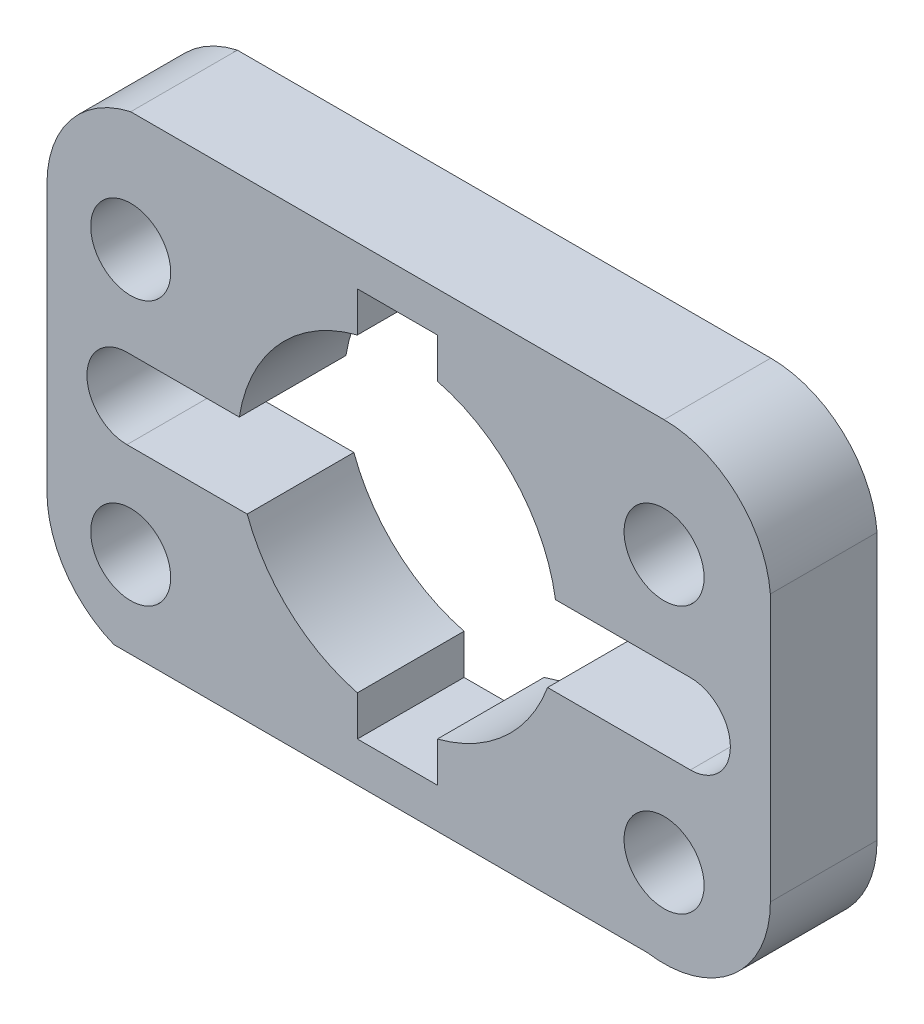
ISO-10303-21;
HEADER;
FILE_DESCRIPTION(('STEP AP214'),'2;1');
FILE_NAME('part.step','',(''),(''),'','','');
FILE_SCHEMA(('AUTOMOTIVE_DESIGN { 1 0 10303 214 1 1 1 1 }'));
ENDSEC;
DATA;
#1=APPLICATION_CONTEXT('core data for automotive mechanical design processes');
#2=APPLICATION_PROTOCOL_DEFINITION('international standard','automotive_design',2000,#1);
#3=PRODUCT_CONTEXT('',#1,'mechanical');
#4=PRODUCT('Part','Part','',(#3));
#5=PRODUCT_RELATED_PRODUCT_CATEGORY('part','',(#4));
#6=PRODUCT_DEFINITION_FORMATION('','',#4);
#7=PRODUCT_DEFINITION_CONTEXT('part definition',#1,'design');
#8=PRODUCT_DEFINITION('design','',#6,#7);
#9=PRODUCT_DEFINITION_SHAPE('','',#8);
#10=(LENGTH_UNIT() NAMED_UNIT(*) SI_UNIT(.MILLI.,.METRE.));
#11=(NAMED_UNIT(*) PLANE_ANGLE_UNIT() SI_UNIT($,.RADIAN.));
#12=(NAMED_UNIT(*) SI_UNIT($,.STERADIAN.) SOLID_ANGLE_UNIT());
#13=UNCERTAINTY_MEASURE_WITH_UNIT(LENGTH_MEASURE(1.E-05),#10,'distance_accuracy_value','');
#14=(GEOMETRIC_REPRESENTATION_CONTEXT(3) GLOBAL_UNCERTAINTY_ASSIGNED_CONTEXT((#13)) GLOBAL_UNIT_ASSIGNED_CONTEXT((#10,
#11,#12)) REPRESENTATION_CONTEXT('',''));
#15=CARTESIAN_POINT('',(0.,0.,0.));
#16=DIRECTION('',(0.,0.,1.));
#17=DIRECTION('',(1.,0.,0.));
#18=AXIS2_PLACEMENT_3D('',#15,#16,#17);
#19=CARTESIAN_POINT('',(5.46026095465038,2.99660257887407,25.4));
#20=DIRECTION('',(0.,0.,1.));
#21=DIRECTION('',(1.,0.,0.));
#22=AXIS2_PLACEMENT_3D('',#19,#20,#21);
#23=PLANE('',#22);
#24=CARTESIAN_POINT('',(127.000131196993,63.4875308494926,25.4));
#25=DIRECTION('',(0.,0.,1.));
#26=DIRECTION('',(1.,0.,0.));
#27=AXIS2_PLACEMENT_3D('',#24,#25,#26);
#28=CIRCLE('',#27,9.525);
#29=CARTESIAN_POINT('',(136.525131196993,63.4875308494926,25.4));
#30=VERTEX_POINT('',#29);
#31=EDGE_CURVE('E378',#30,#30,#28,.T.);
#32=ORIENTED_EDGE('',*,*,#31,.F.);
#33=EDGE_LOOP('',(#32));
#34=FACE_BOUND('',#33,.T.);
#35=CARTESIAN_POINT('',(0.,0.,25.4));
#36=DIRECTION('',(0.,0.,1.));
#37=DIRECTION('',(1.,0.,0.));
#38=AXIS2_PLACEMENT_3D('',#35,#36,#37);
#39=CIRCLE('',#38,9.525);
#40=CARTESIAN_POINT('',(9.525,0.,25.4));
#41=VERTEX_POINT('',#40);
#42=EDGE_CURVE('E394',#41,#41,#39,.T.);
#43=ORIENTED_EDGE('',*,*,#42,.F.);
#44=EDGE_LOOP('',(#43));
#45=FACE_BOUND('',#44,.T.);
#46=CARTESIAN_POINT('',(5.46026095465038,2.99660257887407,25.4));
#47=DIRECTION('',(0.,0.,1.));
#48=DIRECTION('',(1.,0.,0.));
#49=AXIS2_PLACEMENT_3D('',#46,#47,#48);
#50=CIRCLE('',#49,25.4);
#51=CARTESIAN_POINT('',(-19.9397390453496,2.99660257887407,25.4));
#52=VERTEX_POINT('',#51);
#53=CARTESIAN_POINT('',(-3.99585266549915,-20.577576414313,25.4));
#54=VERTEX_POINT('',#53);
#55=EDGE_CURVE('E402',#52,#54,#50,.T.);
#56=ORIENTED_EDGE('',*,*,#55,.T.);
#57=DIRECTION('',(1.,0.,0.));
#58=VECTOR('',#57,1.);
#59=CARTESIAN_POINT('',(-3.99585266549915,-20.577576414313,25.4));
#60=LINE('',#59,#58);
#61=CARTESIAN_POINT('',(123.004147334501,-20.577576414313,25.4));
#62=VERTEX_POINT('',#61);
#63=EDGE_CURVE('E406',#54,#62,#60,.T.);
#64=ORIENTED_EDGE('',*,*,#63,.T.);
#65=CARTESIAN_POINT('',(126.911571268505,4.52007363902799,25.4));
#66=DIRECTION('',(0.,0.,1.));
#67=DIRECTION('',(-1.,0.,0.));
#68=AXIS2_PLACEMENT_3D('',#65,#66,#67);
#69=CIRCLE('',#68,25.4);
#70=CARTESIAN_POINT('',(152.311571268505,4.52007363902799,25.4));
#71=VERTEX_POINT('',#70);
#72=EDGE_CURVE('E410',#62,#71,#69,.T.);
#73=ORIENTED_EDGE('',*,*,#72,.T.);
#74=DIRECTION('',(0.,1.,0.));
#75=VECTOR('',#74,1.);
#76=CARTESIAN_POINT('',(152.311571268505,4.52007363902799,25.4));
#77=LINE('',#76,#75);
#78=CARTESIAN_POINT('',(152.311571268506,68.020073639028,25.4));
#79=VERTEX_POINT('',#78);
#80=EDGE_CURVE('E413',#71,#79,#77,.T.);
#81=ORIENTED_EDGE('',*,*,#80,.T.);
#82=CARTESIAN_POINT('',(126.999973780064,65.9027563309383,25.4));
#83=DIRECTION('',(0.,0.,1.));
#84=DIRECTION('',(-1.,0.,0.));
#85=AXIS2_PLACEMENT_3D('',#82,#83,#84);
#86=CIRCLE('',#85,25.4);
#87=CARTESIAN_POINT('',(126.999973780064,91.3027563309383,25.4));
#88=VERTEX_POINT('',#87);
#89=EDGE_CURVE('E416',#79,#88,#86,.T.);
#90=ORIENTED_EDGE('',*,*,#89,.T.);
#91=DIRECTION('',(-1.,0.,0.));
#92=VECTOR('',#91,1.);
#93=CARTESIAN_POINT('',(-2.62199357100278E-05,91.3027563309383,25.4));
#94=LINE('',#93,#92);
#95=CARTESIAN_POINT('',(-2.62199357100278E-05,91.3027563309383,25.4));
#96=VERTEX_POINT('',#95);
#97=EDGE_CURVE('E419',#88,#96,#94,.T.);
#98=ORIENTED_EDGE('',*,*,#97,.T.);
#99=CARTESIAN_POINT('',(5.46026095465038,66.4966025788741,25.4));
#100=DIRECTION('',(0.,0.,1.));
#101=DIRECTION('',(-1.,0.,0.));
#102=AXIS2_PLACEMENT_3D('',#99,#100,#101);
#103=CIRCLE('',#102,25.4);
#104=CARTESIAN_POINT('',(-19.9397390453496,66.4966025788741,25.4));
#105=VERTEX_POINT('',#104);
#106=EDGE_CURVE('E422',#96,#105,#103,.T.);
#107=ORIENTED_EDGE('',*,*,#106,.T.);
#108=DIRECTION('',(0.,-1.,0.));
#109=VECTOR('',#108,1.);
#110=CARTESIAN_POINT('',(-19.9397390453496,2.99660257887407,25.4));
#111=LINE('',#110,#109);
#112=EDGE_CURVE('E425',#105,#52,#111,.T.);
#113=ORIENTED_EDGE('',*,*,#112,.T.);
#114=EDGE_LOOP('',(#56,#64,#73,#81,#90,#98,#107,#113));
#115=FACE_BOUND('',#114,.T.);
#116=CARTESIAN_POINT('',(0.00144480953424519,62.9099013316316,25.4));
#117=DIRECTION('',(0.,0.,1.));
#118=DIRECTION('',(1.,0.,0.));
#119=AXIS2_PLACEMENT_3D('',#116,#117,#118);
#120=CIRCLE('',#119,9.525);
#121=CARTESIAN_POINT('',(9.52644480953425,62.9099013316316,25.4));
#122=VERTEX_POINT('',#121);
#123=EDGE_CURVE('E386',#122,#122,#120,.T.);
#124=ORIENTED_EDGE('',*,*,#123,.F.);
#125=EDGE_LOOP('',(#124));
#126=FACE_BOUND('',#125,.T.);
#127=CARTESIAN_POINT('',(126.999999387875,-0.0124691503705643,25.4));
#128=DIRECTION('',(0.,0.,1.));
#129=DIRECTION('',(1.,0.,0.));
#130=AXIS2_PLACEMENT_3D('',#127,#128,#129);
#131=CIRCLE('',#130,9.525);
#132=CARTESIAN_POINT('',(136.524999387875,-0.0124691503705643,25.4));
#133=VERTEX_POINT('',#132);
#134=EDGE_CURVE('E370',#133,#133,#131,.T.);
#135=ORIENTED_EDGE('',*,*,#134,.F.);
#136=EDGE_LOOP('',(#135));
#137=FACE_BOUND('',#136,.T.);
#138=DIRECTION('',(1.,0.,0.));
#139=VECTOR('',#138,1.);
#140=CARTESIAN_POINT('',(99.2587184535204,22.2125308496294,25.4));
#141=LINE('',#140,#139);
#142=CARTESIAN_POINT('',(99.2587184535204,22.2125308496294,25.4));
#143=VERTEX_POINT('',#142);
#144=CARTESIAN_POINT('',(133.261571268505,22.2125308496295,25.4));
#145=VERTEX_POINT('',#144);
#146=EDGE_CURVE('E208',#143,#145,#141,.T.);
#147=ORIENTED_EDGE('',*,*,#146,.F.);
#148=CARTESIAN_POINT('',(63.5,35.3625899583126,25.4));
#149=DIRECTION('',(0.,0.,1.));
#150=DIRECTION('',(1.,0.,0.));
#151=AXIS2_PLACEMENT_3D('',#148,#149,#150);
#152=CIRCLE('',#151,38.1);
#153=CARTESIAN_POINT('',(73.025,-1.527576414313,25.4));
#154=VERTEX_POINT('',#153);
#155=EDGE_CURVE('E199',#154,#143,#152,.T.);
#156=ORIENTED_EDGE('',*,*,#155,.F.);
#157=DIRECTION('',(0.,1.,0.));
#158=VECTOR('',#157,1.);
#159=CARTESIAN_POINT('',(73.025,-1.527576414313,25.4));
#160=LINE('',#159,#158);
#161=CARTESIAN_POINT('',(73.025,-11.052576414313,25.4));
#162=VERTEX_POINT('',#161);
#163=EDGE_CURVE('E264',#162,#154,#160,.T.);
#164=ORIENTED_EDGE('',*,*,#163,.F.);
#165=DIRECTION('',(1.,0.,0.));
#166=VECTOR('',#165,1.);
#167=CARTESIAN_POINT('',(62.799638263455,-11.052576414313,25.4));
#168=LINE('',#167,#166);
#169=CARTESIAN_POINT('',(53.975,-11.052576414313,25.4));
#170=VERTEX_POINT('',#169);
#171=EDGE_CURVE('E261',#170,#162,#168,.T.);
#172=ORIENTED_EDGE('',*,*,#171,.F.);
#173=DIRECTION('',(0.,-1.,0.));
#174=VECTOR('',#173,1.);
#175=CARTESIAN_POINT('',(53.975,-1.527576414313,25.4));
#176=LINE('',#175,#174);
#177=CARTESIAN_POINT('',(53.975,-1.527576414313,25.4));
#178=VERTEX_POINT('',#177);
#179=EDGE_CURVE('E258',#178,#170,#176,.T.);
#180=ORIENTED_EDGE('',*,*,#179,.F.);
#181=CARTESIAN_POINT('',(63.5,35.3625899583126,25.4));
#182=DIRECTION('',(0.,0.,1.));
#183=DIRECTION('',(1.,0.,0.));
#184=AXIS2_PLACEMENT_3D('',#181,#182,#183);
#185=CIRCLE('',#184,38.1);
#186=CARTESIAN_POINT('',(27.7412815464796,22.2125308496294,25.4));
#187=VERTEX_POINT('',#186);
#188=EDGE_CURVE('E255',#187,#178,#185,.T.);
#189=ORIENTED_EDGE('',*,*,#188,.F.);
#190=DIRECTION('',(1.,0.,0.));
#191=VECTOR('',#190,1.);
#192=CARTESIAN_POINT('',(-0.889739045349613,22.2125308496294,25.4));
#193=LINE('',#192,#191);
#194=CARTESIAN_POINT('',(-0.889739045349615,22.2125308496294,25.4));
#195=VERTEX_POINT('',#194);
#196=EDGE_CURVE('E252',#195,#187,#193,.T.);
#197=ORIENTED_EDGE('',*,*,#196,.F.);
#198=CARTESIAN_POINT('',(-0.889739045349613,31.7375308496294,25.4));
#199=DIRECTION('',(0.,0.,1.));
#200=DIRECTION('',(1.,0.,0.));
#201=AXIS2_PLACEMENT_3D('',#198,#199,#200);
#202=CIRCLE('',#201,9.525);
#203=CARTESIAN_POINT('',(-0.889739045349613,41.2625308496294,25.4));
#204=VERTEX_POINT('',#203);
#205=EDGE_CURVE('E249',#204,#195,#202,.T.);
#206=ORIENTED_EDGE('',*,*,#205,.F.);
#207=DIRECTION('',(-1.,0.,0.));
#208=VECTOR('',#207,1.);
#209=CARTESIAN_POINT('',(-0.889739045349613,41.2625308496294,25.4));
#210=LINE('',#209,#208);
#211=CARTESIAN_POINT('',(25.8595869114197,41.2625308496294,25.4));
#212=VERTEX_POINT('',#211);
#213=EDGE_CURVE('E246',#212,#204,#210,.T.);
#214=ORIENTED_EDGE('',*,*,#213,.F.);
#215=CARTESIAN_POINT('',(63.5,35.3625899583126,25.4));
#216=DIRECTION('',(0.,0.,1.));
#217=DIRECTION('',(1.,0.,0.));
#218=AXIS2_PLACEMENT_3D('',#215,#216,#217);
#219=CIRCLE('',#218,38.1);
#220=CARTESIAN_POINT('',(53.975,72.2527563309383,25.4));
#221=VERTEX_POINT('',#220);
#222=EDGE_CURVE('E243',#221,#212,#219,.T.);
#223=ORIENTED_EDGE('',*,*,#222,.F.);
#224=DIRECTION('',(0.,-1.,0.));
#225=VECTOR('',#224,1.);
#226=CARTESIAN_POINT('',(53.975,72.2527563309383,25.4));
#227=LINE('',#226,#225);
#228=CARTESIAN_POINT('',(53.975,81.7777563309383,25.4));
#229=VERTEX_POINT('',#228);
#230=EDGE_CURVE('E240',#229,#221,#227,.T.);
#231=ORIENTED_EDGE('',*,*,#230,.F.);
#232=DIRECTION('',(-1.,0.,0.));
#233=VECTOR('',#232,1.);
#234=CARTESIAN_POINT('',(62.3561666756041,81.7777563309383,25.4));
#235=LINE('',#234,#233);
#236=CARTESIAN_POINT('',(73.025,81.7777563309383,25.4));
#237=VERTEX_POINT('',#236);
#238=EDGE_CURVE('E237',#237,#229,#235,.T.);
#239=ORIENTED_EDGE('',*,*,#238,.F.);
#240=DIRECTION('',(0.,1.,0.));
#241=VECTOR('',#240,1.);
#242=CARTESIAN_POINT('',(73.025,72.2527563309383,25.4));
#243=LINE('',#242,#241);
#244=CARTESIAN_POINT('',(73.025,72.2527563309383,25.4));
#245=VERTEX_POINT('',#244);
#246=EDGE_CURVE('E234',#245,#237,#243,.T.);
#247=ORIENTED_EDGE('',*,*,#246,.F.);
#248=CARTESIAN_POINT('',(63.5,35.3625899583126,25.4));
#249=DIRECTION('',(0.,0.,1.));
#250=DIRECTION('',(1.,0.,0.));
#251=AXIS2_PLACEMENT_3D('',#248,#249,#250);
#252=CIRCLE('',#251,38.1);
#253=CARTESIAN_POINT('',(101.14041308858,41.2625308496294,25.4));
#254=VERTEX_POINT('',#253);
#255=EDGE_CURVE('E231',#254,#245,#252,.T.);
#256=ORIENTED_EDGE('',*,*,#255,.F.);
#257=DIRECTION('',(-1.,0.,0.));
#258=VECTOR('',#257,1.);
#259=CARTESIAN_POINT('',(101.14041308858,41.2625308496294,25.4));
#260=LINE('',#259,#258);
#261=CARTESIAN_POINT('',(133.261571268505,41.2625308496294,25.4));
#262=VERTEX_POINT('',#261);
#263=EDGE_CURVE('E226',#262,#254,#260,.T.);
#264=ORIENTED_EDGE('',*,*,#263,.F.);
#265=CARTESIAN_POINT('',(133.261571268505,31.7375308496294,25.4));
#266=DIRECTION('',(0.,0.,1.));
#267=DIRECTION('',(1.,0.,0.));
#268=AXIS2_PLACEMENT_3D('',#265,#266,#267);
#269=CIRCLE('',#268,9.52499999999998);
#270=EDGE_CURVE('E222',#145,#262,#269,.T.);
#271=ORIENTED_EDGE('',*,*,#270,.F.);
#272=EDGE_LOOP('',(#147,#156,#164,#172,#180,#189,#197,#206,#214,#223,#231,#239,#247,#256,#264,#271));
#273=FACE_BOUND('',#272,.T.);
#274=ADVANCED_FACE('F37',(#34,#45,#115,#126,#137,#273),#23,.T.);
#275=CARTESIAN_POINT('',(5.46026095465038,2.99660257887407,0.));
#276=DIRECTION('',(0.,0.,1.));
#277=DIRECTION('',(1.,0.,0.));
#278=AXIS2_PLACEMENT_3D('',#275,#276,#277);
#279=PLANE('',#278);
#280=CARTESIAN_POINT('',(126.999999387875,-0.0124691503705643,0.));
#281=DIRECTION('',(0.,0.,1.));
#282=DIRECTION('',(1.,0.,0.));
#283=AXIS2_PLACEMENT_3D('',#280,#281,#282);
#284=CIRCLE('',#283,9.525);
#285=CARTESIAN_POINT('',(136.524999387875,-0.0124691503705643,0.));
#286=VERTEX_POINT('',#285);
#287=EDGE_CURVE('E217',#286,#286,#284,.T.);
#288=ORIENTED_EDGE('',*,*,#287,.T.);
#289=EDGE_LOOP('',(#288));
#290=FACE_BOUND('',#289,.T.);
#291=CARTESIAN_POINT('',(127.000131196993,63.4875308494926,0.));
#292=DIRECTION('',(0.,0.,1.));
#293=DIRECTION('',(1.,0.,0.));
#294=AXIS2_PLACEMENT_3D('',#291,#292,#293);
#295=CIRCLE('',#294,9.525);
#296=CARTESIAN_POINT('',(136.525131196993,63.4875308494926,0.));
#297=VERTEX_POINT('',#296);
#298=EDGE_CURVE('E374',#297,#297,#295,.T.);
#299=ORIENTED_EDGE('',*,*,#298,.T.);
#300=EDGE_LOOP('',(#299));
#301=FACE_BOUND('',#300,.T.);
#302=CARTESIAN_POINT('',(0.00144480953424519,62.9099013316316,0.));
#303=DIRECTION('',(0.,0.,1.));
#304=DIRECTION('',(1.,0.,0.));
#305=AXIS2_PLACEMENT_3D('',#302,#303,#304);
#306=CIRCLE('',#305,9.525);
#307=CARTESIAN_POINT('',(9.52644480953425,62.9099013316316,0.));
#308=VERTEX_POINT('',#307);
#309=EDGE_CURVE('E382',#308,#308,#306,.T.);
#310=ORIENTED_EDGE('',*,*,#309,.T.);
#311=EDGE_LOOP('',(#310));
#312=FACE_BOUND('',#311,.T.);
#313=CARTESIAN_POINT('',(0.,0.,0.));
#314=DIRECTION('',(0.,0.,1.));
#315=DIRECTION('',(1.,0.,0.));
#316=AXIS2_PLACEMENT_3D('',#313,#314,#315);
#317=CIRCLE('',#316,9.525);
#318=CARTESIAN_POINT('',(9.525,0.,0.));
#319=VERTEX_POINT('',#318);
#320=EDGE_CURVE('E390',#319,#319,#317,.T.);
#321=ORIENTED_EDGE('',*,*,#320,.T.);
#322=EDGE_LOOP('',(#321));
#323=FACE_BOUND('',#322,.T.);
#324=CARTESIAN_POINT('',(5.46026095465038,2.99660257887407,0.));
#325=DIRECTION('',(0.,0.,1.));
#326=DIRECTION('',(1.,0.,0.));
#327=AXIS2_PLACEMENT_3D('',#324,#325,#326);
#328=CIRCLE('',#327,25.4);
#329=CARTESIAN_POINT('',(-19.9397390453496,2.99660257887407,0.));
#330=VERTEX_POINT('',#329);
#331=CARTESIAN_POINT('',(-3.99585266549915,-20.577576414313,0.));
#332=VERTEX_POINT('',#331);
#333=EDGE_CURVE('E398',#330,#332,#328,.T.);
#334=ORIENTED_EDGE('',*,*,#333,.F.);
#335=DIRECTION('',(0.,-1.,0.));
#336=VECTOR('',#335,1.);
#337=CARTESIAN_POINT('',(-19.9397390453496,2.99660257887407,0.));
#338=LINE('',#337,#336);
#339=CARTESIAN_POINT('',(-19.9397390453496,66.4966025788741,0.));
#340=VERTEX_POINT('',#339);
#341=EDGE_CURVE('E407',#340,#330,#338,.T.);
#342=ORIENTED_EDGE('',*,*,#341,.F.);
#343=CARTESIAN_POINT('',(5.46026095465038,66.4966025788741,0.));
#344=DIRECTION('',(0.,0.,1.));
#345=DIRECTION('',(-1.,0.,0.));
#346=AXIS2_PLACEMENT_3D('',#343,#344,#345);
#347=CIRCLE('',#346,25.4);
#348=CARTESIAN_POINT('',(-2.62199357100278E-05,91.3027563309383,0.));
#349=VERTEX_POINT('',#348);
#350=EDGE_CURVE('E447',#349,#340,#347,.T.);
#351=ORIENTED_EDGE('',*,*,#350,.F.);
#352=DIRECTION('',(-1.,0.,0.));
#353=VECTOR('',#352,1.);
#354=CARTESIAN_POINT('',(-2.62199357100278E-05,91.3027563309383,0.));
#355=LINE('',#354,#353);
#356=CARTESIAN_POINT('',(126.999973780064,91.3027563309383,0.));
#357=VERTEX_POINT('',#356);
#358=EDGE_CURVE('E444',#357,#349,#355,.T.);
#359=ORIENTED_EDGE('',*,*,#358,.F.);
#360=CARTESIAN_POINT('',(126.999973780064,65.9027563309383,0.));
#361=DIRECTION('',(0.,0.,1.));
#362=DIRECTION('',(-1.,0.,0.));
#363=AXIS2_PLACEMENT_3D('',#360,#361,#362);
#364=CIRCLE('',#363,25.4);
#365=CARTESIAN_POINT('',(152.311571268506,68.020073639028,0.));
#366=VERTEX_POINT('',#365);
#367=EDGE_CURVE('E441',#366,#357,#364,.T.);
#368=ORIENTED_EDGE('',*,*,#367,.F.);
#369=DIRECTION('',(0.,1.,0.));
#370=VECTOR('',#369,1.);
#371=CARTESIAN_POINT('',(152.311571268505,4.52007363902799,0.));
#372=LINE('',#371,#370);
#373=CARTESIAN_POINT('',(152.311571268505,4.52007363902799,0.));
#374=VERTEX_POINT('',#373);
#375=EDGE_CURVE('E438',#374,#366,#372,.T.);
#376=ORIENTED_EDGE('',*,*,#375,.F.);
#377=CARTESIAN_POINT('',(126.911571268505,4.52007363902799,0.));
#378=DIRECTION('',(0.,0.,1.));
#379=DIRECTION('',(-1.,0.,0.));
#380=AXIS2_PLACEMENT_3D('',#377,#378,#379);
#381=CIRCLE('',#380,25.4);
#382=CARTESIAN_POINT('',(123.004147334501,-20.577576414313,0.));
#383=VERTEX_POINT('',#382);
#384=EDGE_CURVE('E435',#383,#374,#381,.T.);
#385=ORIENTED_EDGE('',*,*,#384,.F.);
#386=DIRECTION('',(1.,0.,0.));
#387=VECTOR('',#386,1.);
#388=CARTESIAN_POINT('',(-3.99585266549915,-20.577576414313,0.));
#389=LINE('',#388,#387);
#390=EDGE_CURVE('E432',#332,#383,#389,.T.);
#391=ORIENTED_EDGE('',*,*,#390,.F.);
#392=EDGE_LOOP('',(#334,#342,#351,#359,#368,#376,#385,#391));
#393=FACE_BOUND('',#392,.T.);
#394=CARTESIAN_POINT('',(63.5,35.3625899583126,0.));
#395=DIRECTION('',(0.,0.,1.));
#396=DIRECTION('',(1.,0.,0.));
#397=AXIS2_PLACEMENT_3D('',#394,#395,#396);
#398=CIRCLE('',#397,38.1);
#399=CARTESIAN_POINT('',(73.025,-1.527576414313,0.));
#400=VERTEX_POINT('',#399);
#401=CARTESIAN_POINT('',(99.2587184535204,22.2125308496294,0.));
#402=VERTEX_POINT('',#401);
#403=EDGE_CURVE('E61',#400,#402,#398,.T.);
#404=ORIENTED_EDGE('',*,*,#403,.T.);
#405=DIRECTION('',(1.,0.,0.));
#406=VECTOR('',#405,1.);
#407=CARTESIAN_POINT('',(99.2587184535204,22.2125308496294,0.));
#408=LINE('',#407,#406);
#409=CARTESIAN_POINT('',(133.261571268505,22.2125308496295,0.));
#410=VERTEX_POINT('',#409);
#411=EDGE_CURVE('E215',#402,#410,#408,.T.);
#412=ORIENTED_EDGE('',*,*,#411,.T.);
#413=CARTESIAN_POINT('',(133.261571268505,31.7375308496294,0.));
#414=DIRECTION('',(0.,0.,1.));
#415=DIRECTION('',(1.,0.,0.));
#416=AXIS2_PLACEMENT_3D('',#413,#414,#415);
#417=CIRCLE('',#416,9.52499999999998);
#418=CARTESIAN_POINT('',(133.261571268505,41.2625308496294,0.));
#419=VERTEX_POINT('',#418);
#420=EDGE_CURVE('E271',#410,#419,#417,.T.);
#421=ORIENTED_EDGE('',*,*,#420,.T.);
#422=DIRECTION('',(-1.,0.,0.));
#423=VECTOR('',#422,1.);
#424=CARTESIAN_POINT('',(101.14041308858,41.2625308496294,0.));
#425=LINE('',#424,#423);
#426=CARTESIAN_POINT('',(101.14041308858,41.2625308496294,0.));
#427=VERTEX_POINT('',#426);
#428=EDGE_CURVE('E275',#419,#427,#425,.T.);
#429=ORIENTED_EDGE('',*,*,#428,.T.);
#430=CARTESIAN_POINT('',(63.5,35.3625899583126,0.));
#431=DIRECTION('',(0.,0.,1.));
#432=DIRECTION('',(1.,0.,0.));
#433=AXIS2_PLACEMENT_3D('',#430,#431,#432);
#434=CIRCLE('',#433,38.1);
#435=CARTESIAN_POINT('',(73.025,72.2527563309383,0.));
#436=VERTEX_POINT('',#435);
#437=EDGE_CURVE('E279',#427,#436,#434,.T.);
#438=ORIENTED_EDGE('',*,*,#437,.T.);
#439=DIRECTION('',(0.,1.,0.));
#440=VECTOR('',#439,1.);
#441=CARTESIAN_POINT('',(73.025,72.2527563309383,0.));
#442=LINE('',#441,#440);
#443=CARTESIAN_POINT('',(73.025,81.7777563309383,0.));
#444=VERTEX_POINT('',#443);
#445=EDGE_CURVE('E283',#436,#444,#442,.T.);
#446=ORIENTED_EDGE('',*,*,#445,.T.);
#447=DIRECTION('',(-1.,0.,0.));
#448=VECTOR('',#447,1.);
#449=CARTESIAN_POINT('',(62.3561666756041,81.7777563309383,0.));
#450=LINE('',#449,#448);
#451=CARTESIAN_POINT('',(53.975,81.7777563309383,0.));
#452=VERTEX_POINT('',#451);
#453=EDGE_CURVE('E287',#444,#452,#450,.T.);
#454=ORIENTED_EDGE('',*,*,#453,.T.);
#455=DIRECTION('',(0.,-1.,0.));
#456=VECTOR('',#455,1.);
#457=CARTESIAN_POINT('',(53.975,72.2527563309383,0.));
#458=LINE('',#457,#456);
#459=CARTESIAN_POINT('',(53.975,72.2527563309383,0.));
#460=VERTEX_POINT('',#459);
#461=EDGE_CURVE('E291',#452,#460,#458,.T.);
#462=ORIENTED_EDGE('',*,*,#461,.T.);
#463=CARTESIAN_POINT('',(63.5,35.3625899583126,0.));
#464=DIRECTION('',(0.,0.,1.));
#465=DIRECTION('',(1.,0.,0.));
#466=AXIS2_PLACEMENT_3D('',#463,#464,#465);
#467=CIRCLE('',#466,38.1);
#468=CARTESIAN_POINT('',(25.8595869114197,41.2625308496294,0.));
#469=VERTEX_POINT('',#468);
#470=EDGE_CURVE('E295',#460,#469,#467,.T.);
#471=ORIENTED_EDGE('',*,*,#470,.T.);
#472=DIRECTION('',(-1.,0.,0.));
#473=VECTOR('',#472,1.);
#474=CARTESIAN_POINT('',(-0.889739045349613,41.2625308496294,0.));
#475=LINE('',#474,#473);
#476=CARTESIAN_POINT('',(-0.889739045349613,41.2625308496294,0.));
#477=VERTEX_POINT('',#476);
#478=EDGE_CURVE('E299',#469,#477,#475,.T.);
#479=ORIENTED_EDGE('',*,*,#478,.T.);
#480=CARTESIAN_POINT('',(-0.889739045349613,31.7375308496294,0.));
#481=DIRECTION('',(0.,0.,1.));
#482=DIRECTION('',(1.,0.,0.));
#483=AXIS2_PLACEMENT_3D('',#480,#481,#482);
#484=CIRCLE('',#483,9.525);
#485=CARTESIAN_POINT('',(-0.889739045349615,22.2125308496294,0.));
#486=VERTEX_POINT('',#485);
#487=EDGE_CURVE('E303',#477,#486,#484,.T.);
#488=ORIENTED_EDGE('',*,*,#487,.T.);
#489=DIRECTION('',(1.,0.,0.));
#490=VECTOR('',#489,1.);
#491=CARTESIAN_POINT('',(-0.889739045349613,22.2125308496294,0.));
#492=LINE('',#491,#490);
#493=CARTESIAN_POINT('',(27.7412815464796,22.2125308496294,0.));
#494=VERTEX_POINT('',#493);
#495=EDGE_CURVE('E307',#486,#494,#492,.T.);
#496=ORIENTED_EDGE('',*,*,#495,.T.);
#497=CARTESIAN_POINT('',(63.5,35.3625899583126,0.));
#498=DIRECTION('',(0.,0.,1.));
#499=DIRECTION('',(1.,0.,0.));
#500=AXIS2_PLACEMENT_3D('',#497,#498,#499);
#501=CIRCLE('',#500,38.1);
#502=CARTESIAN_POINT('',(53.975,-1.527576414313,0.));
#503=VERTEX_POINT('',#502);
#504=EDGE_CURVE('E311',#494,#503,#501,.T.);
#505=ORIENTED_EDGE('',*,*,#504,.T.);
#506=DIRECTION('',(0.,-1.,0.));
#507=VECTOR('',#506,1.);
#508=CARTESIAN_POINT('',(53.975,-1.527576414313,0.));
#509=LINE('',#508,#507);
#510=CARTESIAN_POINT('',(53.975,-11.052576414313,0.));
#511=VERTEX_POINT('',#510);
#512=EDGE_CURVE('E315',#503,#511,#509,.T.);
#513=ORIENTED_EDGE('',*,*,#512,.T.);
#514=DIRECTION('',(1.,0.,0.));
#515=VECTOR('',#514,1.);
#516=CARTESIAN_POINT('',(62.799638263455,-11.052576414313,0.));
#517=LINE('',#516,#515);
#518=CARTESIAN_POINT('',(73.025,-11.052576414313,0.));
#519=VERTEX_POINT('',#518);
#520=EDGE_CURVE('E319',#511,#519,#517,.T.);
#521=ORIENTED_EDGE('',*,*,#520,.T.);
#522=DIRECTION('',(0.,1.,0.));
#523=VECTOR('',#522,1.);
#524=CARTESIAN_POINT('',(73.025,-1.527576414313,0.));
#525=LINE('',#524,#523);
#526=EDGE_CURVE('E209',#519,#400,#525,.T.);
#527=ORIENTED_EDGE('',*,*,#526,.T.);
#528=EDGE_LOOP('',(#404,#412,#421,#429,#438,#446,#454,#462,#471,#479,#488,#496,#505,#513,#521,#527));
#529=FACE_BOUND('',#528,.T.);
#530=ADVANCED_FACE('F486',(#290,#301,#312,#323,#393,#529),#279,.F.);
#531=CARTESIAN_POINT('',(5.46026095465038,2.99660257887407,25.4));
#532=DIRECTION('',(0.,0.,-1.));
#533=DIRECTION('',(-1.,0.,0.));
#534=AXIS2_PLACEMENT_3D('',#531,#532,#533);
#535=CYLINDRICAL_SURFACE('',#534,25.4);
#536=ORIENTED_EDGE('',*,*,#333,.T.);
#537=DIRECTION('',(0.,0.,-1.));
#538=VECTOR('',#537,1.);
#539=CARTESIAN_POINT('',(-3.99585266549915,-20.577576414313,25.4));
#540=LINE('',#539,#538);
#541=EDGE_CURVE('E11',#54,#332,#540,.T.);
#542=ORIENTED_EDGE('',*,*,#541,.F.);
#543=ORIENTED_EDGE('',*,*,#55,.F.);
#544=DIRECTION('',(0.,0.,-1.));
#545=VECTOR('',#544,1.);
#546=CARTESIAN_POINT('',(-19.9397390453496,2.99660257887407,25.4));
#547=LINE('',#546,#545);
#548=EDGE_CURVE('E428',#52,#330,#547,.T.);
#549=ORIENTED_EDGE('',*,*,#548,.T.);
#550=EDGE_LOOP('',(#536,#542,#543,#549));
#551=FACE_BOUND('',#550,.T.);
#552=ADVANCED_FACE('F39',(#551),#535,.T.);
#553=CARTESIAN_POINT('',(-3.99585266549915,-20.577576414313,25.4));
#554=DIRECTION('',(0.,1.,0.));
#555=DIRECTION('',(0.,0.,1.));
#556=AXIS2_PLACEMENT_3D('',#553,#554,#555);
#557=PLANE('',#556);
#558=ORIENTED_EDGE('',*,*,#390,.T.);
#559=DIRECTION('',(0.,0.,-1.));
#560=VECTOR('',#559,1.);
#561=CARTESIAN_POINT('',(123.004147334501,-20.577576414313,25.4));
#562=LINE('',#561,#560);
#563=EDGE_CURVE('E46',#62,#383,#562,.T.);
#564=ORIENTED_EDGE('',*,*,#563,.F.);
#565=ORIENTED_EDGE('',*,*,#63,.F.);
#566=ORIENTED_EDGE('',*,*,#541,.T.);
#567=EDGE_LOOP('',(#558,#564,#565,#566));
#568=FACE_BOUND('',#567,.T.);
#569=ADVANCED_FACE('F504',(#568),#557,.F.);
#570=CARTESIAN_POINT('',(126.911571268505,4.52007363902799,25.4));
#571=DIRECTION('',(0.,0.,-1.));
#572=DIRECTION('',(-1.,0.,0.));
#573=AXIS2_PLACEMENT_3D('',#570,#571,#572);
#574=CYLINDRICAL_SURFACE('',#573,25.4);
#575=ORIENTED_EDGE('',*,*,#384,.T.);
#576=DIRECTION('',(0.,0.,-1.));
#577=VECTOR('',#576,1.);
#578=CARTESIAN_POINT('',(152.311571268505,4.52007363902799,25.4));
#579=LINE('',#578,#577);
#580=EDGE_CURVE('E471',#71,#374,#579,.T.);
#581=ORIENTED_EDGE('',*,*,#580,.F.);
#582=ORIENTED_EDGE('',*,*,#72,.F.);
#583=ORIENTED_EDGE('',*,*,#563,.T.);
#584=EDGE_LOOP('',(#575,#581,#582,#583));
#585=FACE_BOUND('',#584,.T.);
#586=ADVANCED_FACE('F480',(#585),#574,.T.);
#587=CARTESIAN_POINT('',(152.311571268505,4.52007363902799,25.4));
#588=DIRECTION('',(-1.,0.,0.));
#589=DIRECTION('',(0.,-1.,0.));
#590=AXIS2_PLACEMENT_3D('',#587,#588,#589);
#591=PLANE('',#590);
#592=ORIENTED_EDGE('',*,*,#375,.T.);
#593=DIRECTION('',(0.,0.,-1.));
#594=VECTOR('',#593,1.);
#595=CARTESIAN_POINT('',(152.311571268506,68.020073639028,25.4));
#596=LINE('',#595,#594);
#597=EDGE_CURVE('E467',#79,#366,#596,.T.);
#598=ORIENTED_EDGE('',*,*,#597,.F.);
#599=ORIENTED_EDGE('',*,*,#80,.F.);
#600=ORIENTED_EDGE('',*,*,#580,.T.);
#601=EDGE_LOOP('',(#592,#598,#599,#600));
#602=FACE_BOUND('',#601,.T.);
#603=ADVANCED_FACE('F492',(#602),#591,.F.);
#604=CARTESIAN_POINT('',(126.999973780064,65.9027563309383,25.4));
#605=DIRECTION('',(0.,0.,-1.));
#606=DIRECTION('',(-1.,0.,0.));
#607=AXIS2_PLACEMENT_3D('',#604,#605,#606);
#608=CYLINDRICAL_SURFACE('',#607,25.4);
#609=ORIENTED_EDGE('',*,*,#367,.T.);
#610=DIRECTION('',(0.,0.,-1.));
#611=VECTOR('',#610,1.);
#612=CARTESIAN_POINT('',(126.999973780064,91.3027563309383,25.4));
#613=LINE('',#612,#611);
#614=EDGE_CURVE('E463',#88,#357,#613,.T.);
#615=ORIENTED_EDGE('',*,*,#614,.F.);
#616=ORIENTED_EDGE('',*,*,#89,.F.);
#617=ORIENTED_EDGE('',*,*,#597,.T.);
#618=EDGE_LOOP('',(#609,#615,#616,#617));
#619=FACE_BOUND('',#618,.T.);
#620=ADVANCED_FACE('F496',(#619),#608,.T.);
#621=CARTESIAN_POINT('',(-2.62199357100278E-05,91.3027563309383,25.4));
#622=DIRECTION('',(0.,-1.,0.));
#623=DIRECTION('',(1.,0.,0.));
#624=AXIS2_PLACEMENT_3D('',#621,#622,#623);
#625=PLANE('',#624);
#626=ORIENTED_EDGE('',*,*,#358,.T.);
#627=DIRECTION('',(0.,0.,-1.));
#628=VECTOR('',#627,1.);
#629=CARTESIAN_POINT('',(-2.62199357100278E-05,91.3027563309383,25.4));
#630=LINE('',#629,#628);
#631=EDGE_CURVE('E459',#96,#349,#630,.T.);
#632=ORIENTED_EDGE('',*,*,#631,.F.);
#633=ORIENTED_EDGE('',*,*,#97,.F.);
#634=ORIENTED_EDGE('',*,*,#614,.T.);
#635=EDGE_LOOP('',(#626,#632,#633,#634));
#636=FACE_BOUND('',#635,.T.);
#637=ADVANCED_FACE('F517',(#636),#625,.F.);
#638=CARTESIAN_POINT('',(5.46026095465038,66.4966025788741,25.4));
#639=DIRECTION('',(0.,0.,-1.));
#640=DIRECTION('',(-1.,0.,0.));
#641=AXIS2_PLACEMENT_3D('',#638,#639,#640);
#642=CYLINDRICAL_SURFACE('',#641,25.4);
#643=ORIENTED_EDGE('',*,*,#350,.T.);
#644=DIRECTION('',(0.,0.,-1.));
#645=VECTOR('',#644,1.);
#646=CARTESIAN_POINT('',(-19.9397390453496,66.4966025788741,25.4));
#647=LINE('',#646,#645);
#648=EDGE_CURVE('E455',#105,#340,#647,.T.);
#649=ORIENTED_EDGE('',*,*,#648,.F.);
#650=ORIENTED_EDGE('',*,*,#106,.F.);
#651=ORIENTED_EDGE('',*,*,#631,.T.);
#652=EDGE_LOOP('',(#643,#649,#650,#651));
#653=FACE_BOUND('',#652,.T.);
#654=ADVANCED_FACE('F515',(#653),#642,.T.);
#655=CARTESIAN_POINT('',(-19.9397390453496,2.99660257887407,25.4));
#656=DIRECTION('',(1.,0.,0.));
#657=DIRECTION('',(0.,0.,-1.));
#658=AXIS2_PLACEMENT_3D('',#655,#656,#657);
#659=PLANE('',#658);
#660=ORIENTED_EDGE('',*,*,#341,.T.);
#661=ORIENTED_EDGE('',*,*,#548,.F.);
#662=ORIENTED_EDGE('',*,*,#112,.F.);
#663=ORIENTED_EDGE('',*,*,#648,.T.);
#664=EDGE_LOOP('',(#660,#661,#662,#663));
#665=FACE_BOUND('',#664,.T.);
#666=ADVANCED_FACE('F510',(#665),#659,.F.);
#667=CARTESIAN_POINT('',(0.,0.,25.4));
#668=DIRECTION('',(0.,0.,-1.));
#669=DIRECTION('',(-1.,0.,0.));
#670=AXIS2_PLACEMENT_3D('',#667,#668,#669);
#671=CYLINDRICAL_SURFACE('',#670,9.525);
#672=ORIENTED_EDGE('',*,*,#42,.T.);
#673=EDGE_LOOP('',(#672));
#674=FACE_BOUND('',#673,.T.);
#675=ORIENTED_EDGE('',*,*,#320,.F.);
#676=EDGE_LOOP('',(#675));
#677=FACE_BOUND('',#676,.T.);
#678=ADVANCED_FACE('F537',(#674,#677),#671,.F.);
#679=CARTESIAN_POINT('',(0.00144480953424519,62.9099013316316,25.4));
#680=DIRECTION('',(0.,0.,-1.));
#681=DIRECTION('',(-1.,0.,0.));
#682=AXIS2_PLACEMENT_3D('',#679,#680,#681);
#683=CYLINDRICAL_SURFACE('',#682,9.525);
#684=ORIENTED_EDGE('',*,*,#123,.T.);
#685=EDGE_LOOP('',(#684));
#686=FACE_BOUND('',#685,.T.);
#687=ORIENTED_EDGE('',*,*,#309,.F.);
#688=EDGE_LOOP('',(#687));
#689=FACE_BOUND('',#688,.T.);
#690=ADVANCED_FACE('F544',(#686,#689),#683,.F.);
#691=CARTESIAN_POINT('',(127.000131196993,63.4875308494926,25.4));
#692=DIRECTION('',(0.,0.,-1.));
#693=DIRECTION('',(-1.,0.,0.));
#694=AXIS2_PLACEMENT_3D('',#691,#692,#693);
#695=CYLINDRICAL_SURFACE('',#694,9.525);
#696=ORIENTED_EDGE('',*,*,#31,.T.);
#697=EDGE_LOOP('',(#696));
#698=FACE_BOUND('',#697,.T.);
#699=ORIENTED_EDGE('',*,*,#298,.F.);
#700=EDGE_LOOP('',(#699));
#701=FACE_BOUND('',#700,.T.);
#702=ADVANCED_FACE('F549',(#698,#701),#695,.F.);
#703=CARTESIAN_POINT('',(126.999999387875,-0.0124691503705643,25.4));
#704=DIRECTION('',(0.,0.,-1.));
#705=DIRECTION('',(-1.,0.,0.));
#706=AXIS2_PLACEMENT_3D('',#703,#704,#705);
#707=CYLINDRICAL_SURFACE('',#706,9.525);
#708=ORIENTED_EDGE('',*,*,#134,.T.);
#709=EDGE_LOOP('',(#708));
#710=FACE_BOUND('',#709,.T.);
#711=ORIENTED_EDGE('',*,*,#287,.F.);
#712=EDGE_LOOP('',(#711));
#713=FACE_BOUND('',#712,.T.);
#714=ADVANCED_FACE('F558',(#710,#713),#707,.F.);
#715=CARTESIAN_POINT('',(63.5,35.3625899583126,25.4));
#716=DIRECTION('',(0.,0.,-1.));
#717=DIRECTION('',(-1.,0.,0.));
#718=AXIS2_PLACEMENT_3D('',#715,#716,#717);
#719=CYLINDRICAL_SURFACE('',#718,38.1);
#720=ORIENTED_EDGE('',*,*,#403,.F.);
#721=DIRECTION('',(0.,0.,-1.));
#722=VECTOR('',#721,1.);
#723=CARTESIAN_POINT('',(73.025,-1.527576414313,25.4));
#724=LINE('',#723,#722);
#725=EDGE_CURVE('E203',#154,#400,#724,.T.);
#726=ORIENTED_EDGE('',*,*,#725,.F.);
#727=ORIENTED_EDGE('',*,*,#155,.T.);
#728=DIRECTION('',(0.,0.,-1.));
#729=VECTOR('',#728,1.);
#730=CARTESIAN_POINT('',(99.2587184535204,22.2125308496294,25.4));
#731=LINE('',#730,#729);
#732=EDGE_CURVE('E202',#143,#402,#731,.T.);
#733=ORIENTED_EDGE('',*,*,#732,.T.);
#734=EDGE_LOOP('',(#720,#726,#727,#733));
#735=FACE_BOUND('',#734,.T.);
#736=ADVANCED_FACE('F201',(#735),#719,.F.);
#737=CARTESIAN_POINT('',(99.2587184535204,22.2125308496294,25.4));
#738=DIRECTION('',(0.,1.,0.));
#739=DIRECTION('',(-1.,0.,0.));
#740=AXIS2_PLACEMENT_3D('',#737,#738,#739);
#741=PLANE('',#740);
#742=ORIENTED_EDGE('',*,*,#411,.F.);
#743=ORIENTED_EDGE('',*,*,#732,.F.);
#744=ORIENTED_EDGE('',*,*,#146,.T.);
#745=DIRECTION('',(0.,0.,-1.));
#746=VECTOR('',#745,1.);
#747=CARTESIAN_POINT('',(133.261571268505,22.2125308496295,25.4));
#748=LINE('',#747,#746);
#749=EDGE_CURVE('E218',#145,#410,#748,.T.);
#750=ORIENTED_EDGE('',*,*,#749,.T.);
#751=EDGE_LOOP('',(#742,#743,#744,#750));
#752=FACE_BOUND('',#751,.T.);
#753=ADVANCED_FACE('F212',(#752),#741,.T.);
#754=CARTESIAN_POINT('',(133.261571268505,31.7375308496294,25.4));
#755=DIRECTION('',(0.,0.,-1.));
#756=DIRECTION('',(-1.,0.,0.));
#757=AXIS2_PLACEMENT_3D('',#754,#755,#756);
#758=CYLINDRICAL_SURFACE('',#757,9.52499999999998);
#759=ORIENTED_EDGE('',*,*,#420,.F.);
#760=ORIENTED_EDGE('',*,*,#749,.F.);
#761=ORIENTED_EDGE('',*,*,#270,.T.);
#762=DIRECTION('',(0.,0.,-1.));
#763=VECTOR('',#762,1.);
#764=CARTESIAN_POINT('',(133.261571268505,41.2625308496294,25.4));
#765=LINE('',#764,#763);
#766=EDGE_CURVE('E365',#262,#419,#765,.T.);
#767=ORIENTED_EDGE('',*,*,#766,.T.);
#768=EDGE_LOOP('',(#759,#760,#761,#767));
#769=FACE_BOUND('',#768,.T.);
#770=ADVANCED_FACE('F570',(#769),#758,.F.);
#771=CARTESIAN_POINT('',(101.14041308858,41.2625308496294,25.4));
#772=DIRECTION('',(0.,-1.,0.));
#773=DIRECTION('',(1.,0.,0.));
#774=AXIS2_PLACEMENT_3D('',#771,#772,#773);
#775=PLANE('',#774);
#776=ORIENTED_EDGE('',*,*,#428,.F.);
#777=ORIENTED_EDGE('',*,*,#766,.F.);
#778=ORIENTED_EDGE('',*,*,#263,.T.);
#779=DIRECTION('',(0.,0.,-1.));
#780=VECTOR('',#779,1.);
#781=CARTESIAN_POINT('',(101.14041308858,41.2625308496294,25.4));
#782=LINE('',#781,#780);
#783=EDGE_CURVE('E362',#254,#427,#782,.T.);
#784=ORIENTED_EDGE('',*,*,#783,.T.);
#785=EDGE_LOOP('',(#776,#777,#778,#784));
#786=FACE_BOUND('',#785,.T.);
#787=ADVANCED_FACE('F573',(#786),#775,.T.);
#788=CARTESIAN_POINT('',(63.5,35.3625899583126,25.4));
#789=DIRECTION('',(0.,0.,-1.));
#790=DIRECTION('',(-1.,0.,0.));
#791=AXIS2_PLACEMENT_3D('',#788,#789,#790);
#792=CYLINDRICAL_SURFACE('',#791,38.1);
#793=ORIENTED_EDGE('',*,*,#437,.F.);
#794=ORIENTED_EDGE('',*,*,#783,.F.);
#795=ORIENTED_EDGE('',*,*,#255,.T.);
#796=DIRECTION('',(0.,0.,-1.));
#797=VECTOR('',#796,1.);
#798=CARTESIAN_POINT('',(73.025,72.2527563309383,25.4));
#799=LINE('',#798,#797);
#800=EDGE_CURVE('E359',#245,#436,#799,.T.);
#801=ORIENTED_EDGE('',*,*,#800,.T.);
#802=EDGE_LOOP('',(#793,#794,#795,#801));
#803=FACE_BOUND('',#802,.T.);
#804=ADVANCED_FACE('F577',(#803),#792,.F.);
#805=CARTESIAN_POINT('',(73.025,72.2527563309383,25.4));
#806=DIRECTION('',(-1.,0.,0.));
#807=DIRECTION('',(0.,0.,1.));
#808=AXIS2_PLACEMENT_3D('',#805,#806,#807);
#809=PLANE('',#808);
#810=ORIENTED_EDGE('',*,*,#445,.F.);
#811=ORIENTED_EDGE('',*,*,#800,.F.);
#812=ORIENTED_EDGE('',*,*,#246,.T.);
#813=DIRECTION('',(0.,0.,-1.));
#814=VECTOR('',#813,1.);
#815=CARTESIAN_POINT('',(73.025,81.7777563309383,25.4));
#816=LINE('',#815,#814);
#817=EDGE_CURVE('E355',#237,#444,#816,.T.);
#818=ORIENTED_EDGE('',*,*,#817,.T.);
#819=EDGE_LOOP('',(#810,#811,#812,#818));
#820=FACE_BOUND('',#819,.T.);
#821=ADVANCED_FACE('F581',(#820),#809,.T.);
#822=CARTESIAN_POINT('',(62.3561666756041,81.7777563309383,25.4));
#823=DIRECTION('',(0.,-1.,0.));
#824=DIRECTION('',(1.,0.,0.));
#825=AXIS2_PLACEMENT_3D('',#822,#823,#824);
#826=PLANE('',#825);
#827=ORIENTED_EDGE('',*,*,#453,.F.);
#828=ORIENTED_EDGE('',*,*,#817,.F.);
#829=ORIENTED_EDGE('',*,*,#238,.T.);
#830=DIRECTION('',(0.,0.,-1.));
#831=VECTOR('',#830,1.);
#832=CARTESIAN_POINT('',(53.975,81.7777563309383,25.4));
#833=LINE('',#832,#831);
#834=EDGE_CURVE('E352',#229,#452,#833,.T.);
#835=ORIENTED_EDGE('',*,*,#834,.T.);
#836=EDGE_LOOP('',(#827,#828,#829,#835));
#837=FACE_BOUND('',#836,.T.);
#838=ADVANCED_FACE('F585',(#837),#826,.T.);
#839=CARTESIAN_POINT('',(53.975,72.2527563309383,25.4));
#840=DIRECTION('',(1.,0.,0.));
#841=DIRECTION('',(0.,0.,-1.));
#842=AXIS2_PLACEMENT_3D('',#839,#840,#841);
#843=PLANE('',#842);
#844=ORIENTED_EDGE('',*,*,#461,.F.);
#845=ORIENTED_EDGE('',*,*,#834,.F.);
#846=ORIENTED_EDGE('',*,*,#230,.T.);
#847=DIRECTION('',(0.,0.,-1.));
#848=VECTOR('',#847,1.);
#849=CARTESIAN_POINT('',(53.975,72.2527563309383,25.4));
#850=LINE('',#849,#848);
#851=EDGE_CURVE('E349',#221,#460,#850,.T.);
#852=ORIENTED_EDGE('',*,*,#851,.T.);
#853=EDGE_LOOP('',(#844,#845,#846,#852));
#854=FACE_BOUND('',#853,.T.);
#855=ADVANCED_FACE('F589',(#854),#843,.T.);
#856=CARTESIAN_POINT('',(63.5,35.3625899583126,25.4));
#857=DIRECTION('',(0.,0.,-1.));
#858=DIRECTION('',(-1.,0.,0.));
#859=AXIS2_PLACEMENT_3D('',#856,#857,#858);
#860=CYLINDRICAL_SURFACE('',#859,38.1);
#861=ORIENTED_EDGE('',*,*,#470,.F.);
#862=ORIENTED_EDGE('',*,*,#851,.F.);
#863=ORIENTED_EDGE('',*,*,#222,.T.);
#864=DIRECTION('',(0.,0.,-1.));
#865=VECTOR('',#864,1.);
#866=CARTESIAN_POINT('',(25.8595869114197,41.2625308496294,25.4));
#867=LINE('',#866,#865);
#868=EDGE_CURVE('E346',#212,#469,#867,.T.);
#869=ORIENTED_EDGE('',*,*,#868,.T.);
#870=EDGE_LOOP('',(#861,#862,#863,#869));
#871=FACE_BOUND('',#870,.T.);
#872=ADVANCED_FACE('F593',(#871),#860,.F.);
#873=CARTESIAN_POINT('',(-0.889739045349613,41.2625308496294,25.4));
#874=DIRECTION('',(0.,-1.,0.));
#875=DIRECTION('',(0.,0.,-1.));
#876=AXIS2_PLACEMENT_3D('',#873,#874,#875);
#877=PLANE('',#876);
#878=ORIENTED_EDGE('',*,*,#478,.F.);
#879=ORIENTED_EDGE('',*,*,#868,.F.);
#880=ORIENTED_EDGE('',*,*,#213,.T.);
#881=DIRECTION('',(0.,0.,-1.));
#882=VECTOR('',#881,1.);
#883=CARTESIAN_POINT('',(-0.889739045349613,41.2625308496294,25.4));
#884=LINE('',#883,#882);
#885=EDGE_CURVE('E343',#204,#477,#884,.T.);
#886=ORIENTED_EDGE('',*,*,#885,.T.);
#887=EDGE_LOOP('',(#878,#879,#880,#886));
#888=FACE_BOUND('',#887,.T.);
#889=ADVANCED_FACE('F597',(#888),#877,.T.);
#890=CARTESIAN_POINT('',(-0.889739045349613,31.7375308496294,25.4));
#891=DIRECTION('',(0.,0.,-1.));
#892=DIRECTION('',(-1.,0.,0.));
#893=AXIS2_PLACEMENT_3D('',#890,#891,#892);
#894=CYLINDRICAL_SURFACE('',#893,9.525);
#895=ORIENTED_EDGE('',*,*,#487,.F.);
#896=ORIENTED_EDGE('',*,*,#885,.F.);
#897=ORIENTED_EDGE('',*,*,#205,.T.);
#898=DIRECTION('',(0.,0.,-1.));
#899=VECTOR('',#898,1.);
#900=CARTESIAN_POINT('',(-0.889739045349615,22.2125308496294,25.4));
#901=LINE('',#900,#899);
#902=EDGE_CURVE('E340',#195,#486,#901,.T.);
#903=ORIENTED_EDGE('',*,*,#902,.T.);
#904=EDGE_LOOP('',(#895,#896,#897,#903));
#905=FACE_BOUND('',#904,.T.);
#906=ADVANCED_FACE('F601',(#905),#894,.F.);
#907=CARTESIAN_POINT('',(-0.889739045349613,22.2125308496294,25.4));
#908=DIRECTION('',(0.,1.,0.));
#909=DIRECTION('',(-1.,0.,0.));
#910=AXIS2_PLACEMENT_3D('',#907,#908,#909);
#911=PLANE('',#910);
#912=ORIENTED_EDGE('',*,*,#495,.F.);
#913=ORIENTED_EDGE('',*,*,#902,.F.);
#914=ORIENTED_EDGE('',*,*,#196,.T.);
#915=DIRECTION('',(0.,0.,-1.));
#916=VECTOR('',#915,1.);
#917=CARTESIAN_POINT('',(27.7412815464796,22.2125308496294,25.4));
#918=LINE('',#917,#916);
#919=EDGE_CURVE('E337',#187,#494,#918,.T.);
#920=ORIENTED_EDGE('',*,*,#919,.T.);
#921=EDGE_LOOP('',(#912,#913,#914,#920));
#922=FACE_BOUND('',#921,.T.);
#923=ADVANCED_FACE('F605',(#922),#911,.T.);
#924=CARTESIAN_POINT('',(63.5,35.3625899583126,25.4));
#925=DIRECTION('',(0.,0.,-1.));
#926=DIRECTION('',(-1.,0.,0.));
#927=AXIS2_PLACEMENT_3D('',#924,#925,#926);
#928=CYLINDRICAL_SURFACE('',#927,38.1);
#929=ORIENTED_EDGE('',*,*,#504,.F.);
#930=ORIENTED_EDGE('',*,*,#919,.F.);
#931=ORIENTED_EDGE('',*,*,#188,.T.);
#932=DIRECTION('',(0.,0.,-1.));
#933=VECTOR('',#932,1.);
#934=CARTESIAN_POINT('',(53.975,-1.527576414313,25.4));
#935=LINE('',#934,#933);
#936=EDGE_CURVE('E334',#178,#503,#935,.T.);
#937=ORIENTED_EDGE('',*,*,#936,.T.);
#938=EDGE_LOOP('',(#929,#930,#931,#937));
#939=FACE_BOUND('',#938,.T.);
#940=ADVANCED_FACE('F609',(#939),#928,.F.);
#941=CARTESIAN_POINT('',(53.975,-1.527576414313,25.4));
#942=DIRECTION('',(1.,0.,0.));
#943=DIRECTION('',(0.,0.,-1.));
#944=AXIS2_PLACEMENT_3D('',#941,#942,#943);
#945=PLANE('',#944);
#946=ORIENTED_EDGE('',*,*,#512,.F.);
#947=ORIENTED_EDGE('',*,*,#936,.F.);
#948=ORIENTED_EDGE('',*,*,#179,.T.);
#949=DIRECTION('',(0.,0.,-1.));
#950=VECTOR('',#949,1.);
#951=CARTESIAN_POINT('',(53.975,-11.052576414313,25.4));
#952=LINE('',#951,#950);
#953=EDGE_CURVE('E330',#170,#511,#952,.T.);
#954=ORIENTED_EDGE('',*,*,#953,.T.);
#955=EDGE_LOOP('',(#946,#947,#948,#954));
#956=FACE_BOUND('',#955,.T.);
#957=ADVANCED_FACE('F613',(#956),#945,.T.);
#958=CARTESIAN_POINT('',(62.799638263455,-11.052576414313,25.4));
#959=DIRECTION('',(0.,1.,0.));
#960=DIRECTION('',(0.,0.,1.));
#961=AXIS2_PLACEMENT_3D('',#958,#959,#960);
#962=PLANE('',#961);
#963=ORIENTED_EDGE('',*,*,#520,.F.);
#964=ORIENTED_EDGE('',*,*,#953,.F.);
#965=ORIENTED_EDGE('',*,*,#171,.T.);
#966=DIRECTION('',(0.,0.,-1.));
#967=VECTOR('',#966,1.);
#968=CARTESIAN_POINT('',(73.025,-11.052576414313,25.4));
#969=LINE('',#968,#967);
#970=EDGE_CURVE('E53',#162,#519,#969,.T.);
#971=ORIENTED_EDGE('',*,*,#970,.T.);
#972=EDGE_LOOP('',(#963,#964,#965,#971));
#973=FACE_BOUND('',#972,.T.);
#974=ADVANCED_FACE('F617',(#973),#962,.T.);
#975=CARTESIAN_POINT('',(73.025,-1.527576414313,25.4));
#976=DIRECTION('',(-1.,0.,0.));
#977=DIRECTION('',(0.,0.,1.));
#978=AXIS2_PLACEMENT_3D('',#975,#976,#977);
#979=PLANE('',#978);
#980=ORIENTED_EDGE('',*,*,#526,.F.);
#981=ORIENTED_EDGE('',*,*,#970,.F.);
#982=ORIENTED_EDGE('',*,*,#163,.T.);
#983=ORIENTED_EDGE('',*,*,#725,.T.);
#984=EDGE_LOOP('',(#980,#981,#982,#983));
#985=FACE_BOUND('',#984,.T.);
#986=ADVANCED_FACE('F621',(#985),#979,.T.);
#987=CLOSED_SHELL('',(#274,#530,#552,#569,#586,#603,#620,#637,#654,#666,#678,#690,#702,#714,
#736,#753,#770,#787,#804,#821,#838,#855,#872,#889,#906,#923,#940,#957,#974,#986));
#988=MANIFOLD_SOLID_BREP('B2',#987);
#989=ADVANCED_BREP_SHAPE_REPRESENTATION('',(#18,#988),#14);
#990=SHAPE_DEFINITION_REPRESENTATION(#9,#989);
ENDSEC;
END-ISO-10303-21;
